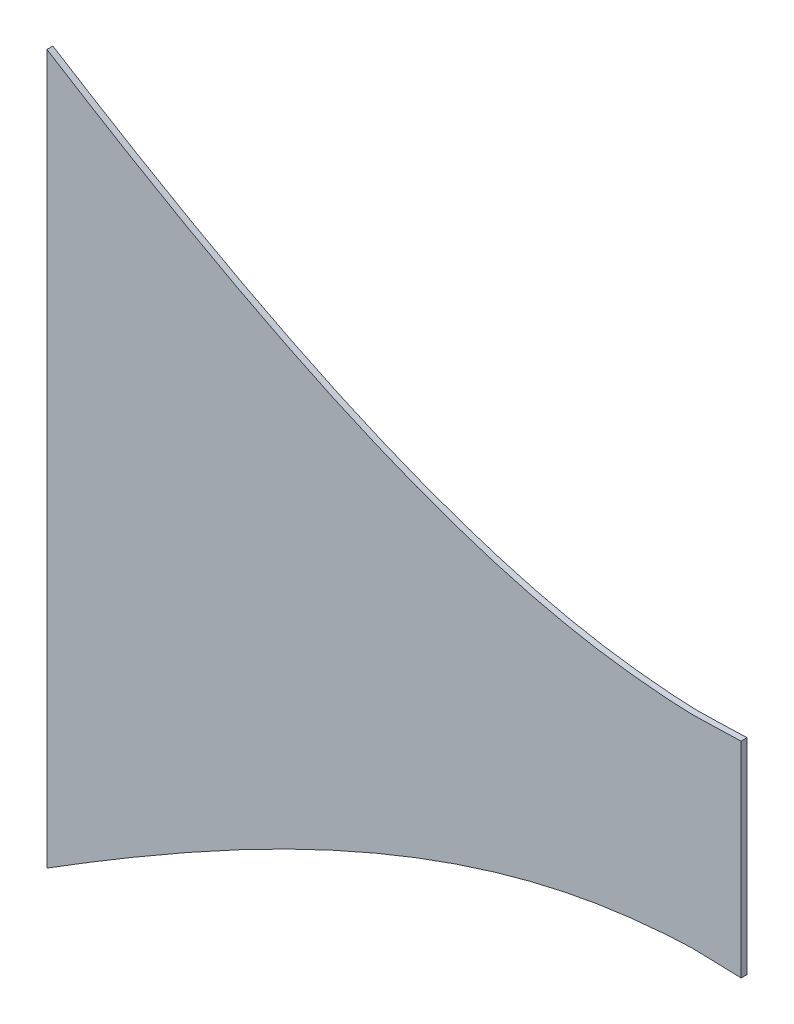
ISO-10303-21;
HEADER;
FILE_DESCRIPTION(('STEP AP214'),'2;1');
FILE_NAME('part.step','',(''),(''),'','','');
FILE_SCHEMA(('AUTOMOTIVE_DESIGN { 1 0 10303 214 1 1 1 1 }'));
ENDSEC;
DATA;
#1=APPLICATION_CONTEXT('core data for automotive mechanical design processes');
#2=APPLICATION_PROTOCOL_DEFINITION('international standard','automotive_design',2000,#1);
#3=PRODUCT_CONTEXT('',#1,'mechanical');
#4=PRODUCT('Part','Part','',(#3));
#5=PRODUCT_RELATED_PRODUCT_CATEGORY('part','',(#4));
#6=PRODUCT_DEFINITION_FORMATION('','',#4);
#7=PRODUCT_DEFINITION_CONTEXT('part definition',#1,'design');
#8=PRODUCT_DEFINITION('design','',#6,#7);
#9=PRODUCT_DEFINITION_SHAPE('','',#8);
#10=(LENGTH_UNIT() NAMED_UNIT(*) SI_UNIT(.MILLI.,.METRE.));
#11=(NAMED_UNIT(*) PLANE_ANGLE_UNIT() SI_UNIT($,.RADIAN.));
#12=(NAMED_UNIT(*) SI_UNIT($,.STERADIAN.) SOLID_ANGLE_UNIT());
#13=UNCERTAINTY_MEASURE_WITH_UNIT(LENGTH_MEASURE(1.E-05),#10,'distance_accuracy_value','');
#14=(GEOMETRIC_REPRESENTATION_CONTEXT(3) GLOBAL_UNCERTAINTY_ASSIGNED_CONTEXT((#13)) GLOBAL_UNIT_ASSIGNED_CONTEXT((#10,
#11,#12)) REPRESENTATION_CONTEXT('',''));
#15=CARTESIAN_POINT('',(0.,0.,0.));
#16=DIRECTION('',(0.,0.,1.));
#17=DIRECTION('',(1.,0.,0.));
#18=AXIS2_PLACEMENT_3D('',#15,#16,#17);
#19=CARTESIAN_POINT('',(630.060155948163,17.230821144255,0.5));
#20=CARTESIAN_POINT('',(630.060155948163,17.230821144255,-0.5));
#21=CARTESIAN_POINT('',(624.290147678381,17.1434943990268,0.5));
#22=CARTESIAN_POINT('',(624.290147678381,17.1434943990268,-0.5));
#23=CARTESIAN_POINT('',(623.249163071546,16.6434483722831,0.5));
#24=CARTESIAN_POINT('',(623.249163071546,16.6434483722831,-0.5));
#25=CARTESIAN_POINT('',(580.468042757777,20.422908744546,0.5));
#26=CARTESIAN_POINT('',(580.468042757777,20.422908744546,-0.5));
#27=CARTESIAN_POINT('',(542.806075293805,41.2067284704848,0.5));
#28=CARTESIAN_POINT('',(542.806075293805,41.2067284704848,-0.5));
#29=CARTESIAN_POINT('',(513.444999676251,59.5485061348377,0.5));
#30=CARTESIAN_POINT('',(513.444999676251,59.5485061348377,-0.5));
#31=(BOUNDED_SURFACE() B_SPLINE_SURFACE(3,1,((#19,#20),(#21,#22),(#23,#24),(#25,#26),(#27,#28),
(#29,#30)),.UNSPECIFIED.,.F.,.F.,.F.) B_SPLINE_SURFACE_WITH_KNOTS((4,1,1,4),(2,2),(0.,
0.149292969433812,0.239589353801839,0.902963843680264),(0.,1.),
.UNSPECIFIED.) GEOMETRIC_REPRESENTATION_ITEM() RATIONAL_B_SPLINE_SURFACE(((1.,1.),(1.,1.),(1.,
1.),(1.,1.),(1.,1.),(1.,1.))) REPRESENTATION_ITEM('') SURFACE());
#32=CARTESIAN_POINT('',(630.060155948163,17.230821144255,-0.5));
#33=CARTESIAN_POINT('',(624.290147678381,17.1434943990268,-0.5));
#34=CARTESIAN_POINT('',(623.249163071546,16.6434483722831,-0.5));
#35=CARTESIAN_POINT('',(580.468042757777,20.422908744546,-0.5));
#36=CARTESIAN_POINT('',(542.806075293805,41.2067284704848,-0.5));
#37=CARTESIAN_POINT('',(513.444999676251,59.5485061348377,-0.5));
#38=(BOUNDED_CURVE() B_SPLINE_CURVE(3,(#32,#33,#34,#35,#36,#37),.UNSPECIFIED.,.F.,
.F.) B_SPLINE_CURVE_WITH_KNOTS((4,1,1,4),(0.,0.149292969433812,0.239589353801839,
0.902963843680264),
.UNSPECIFIED.) CURVE() GEOMETRIC_REPRESENTATION_ITEM() RATIONAL_B_SPLINE_CURVE((1.,1.,1.,1.,1.,1.)) REPRESENTATION_ITEM(''));
#39=CARTESIAN_POINT('',(630.060155948163,17.230821144255,-0.5));
#40=VERTEX_POINT('',#39);
#41=CARTESIAN_POINT('',(513.444999676251,59.5485061348377,-0.5));
#42=VERTEX_POINT('',#41);
#43=EDGE_CURVE('E110',#40,#42,#38,.T.);
#44=DIRECTION('',(0.,0.,-1.));
#45=VECTOR('',#44,1.);
#46=CARTESIAN_POINT('',(513.444999676251,59.5485061348377,0.5));
#47=LINE('',#46,#45);
#48=CARTESIAN_POINT('',(513.444999676251,59.5485061348377,0.5));
#49=VERTEX_POINT('',#48);
#50=EDGE_CURVE('E149',#49,#42,#47,.T.);
#51=CARTESIAN_POINT('',(630.060155948163,17.230821144255,0.5));
#52=CARTESIAN_POINT('',(624.290147678381,17.1434943990268,0.5));
#53=CARTESIAN_POINT('',(623.249163071546,16.6434483722831,0.5));
#54=CARTESIAN_POINT('',(580.468042757777,20.422908744546,0.5));
#55=CARTESIAN_POINT('',(542.806075293805,41.2067284704848,0.5));
#56=CARTESIAN_POINT('',(513.444999676251,59.5485061348377,0.5));
#57=(BOUNDED_CURVE() B_SPLINE_CURVE(3,(#51,#52,#53,#54,#55,#56),.UNSPECIFIED.,.F.,
.F.) B_SPLINE_CURVE_WITH_KNOTS((4,1,1,4),(0.,0.149292969433812,0.239589353801839,
0.902963843680264),
.UNSPECIFIED.) CURVE() GEOMETRIC_REPRESENTATION_ITEM() RATIONAL_B_SPLINE_CURVE((1.,1.,1.,1.,1.,1.)) REPRESENTATION_ITEM(''));
#58=CARTESIAN_POINT('',(630.060155948163,17.230821144255,0.5));
#59=VERTEX_POINT('',#58);
#60=EDGE_CURVE('E155',#59,#49,#57,.T.);
#61=DIRECTION('',(0.,0.,-1.));
#62=VECTOR('',#61,1.);
#63=CARTESIAN_POINT('',(630.060155948163,17.230821144255,0.5));
#64=LINE('',#63,#62);
#65=EDGE_CURVE('E162',#59,#40,#64,.T.);
#66=ORIENTED_EDGE('',*,*,#43,.T.);
#67=ORIENTED_EDGE('',*,*,#50,.F.);
#68=ORIENTED_EDGE('',*,*,#60,.F.);
#69=ORIENTED_EDGE('',*,*,#65,.T.);
#70=EDGE_LOOP('',(#66,#67,#68,#69));
#71=FACE_BOUND('',#70,.T.);
#72=ADVANCED_FACE('F50',(#71),#31,.F.);
#73=CARTESIAN_POINT('',(576.986065958673,26.4563585070162,0.5));
#74=DIRECTION('',(0.,0.,-1.));
#75=DIRECTION('',(0.,-1.,0.));
#76=AXIS2_PLACEMENT_3D('',#73,#74,#75);
#77=PLANE('',#76);
#78=DIRECTION('',(0.,-1.,0.));
#79=VECTOR('',#78,1.);
#80=CARTESIAN_POINT('',(513.444999676251,59.5485061348377,0.5));
#81=LINE('',#80,#79);
#82=CARTESIAN_POINT('',(513.444999676251,-59.5485061348377,0.5));
#83=VERTEX_POINT('',#82);
#84=EDGE_CURVE('E80',#49,#83,#81,.T.);
#85=ORIENTED_EDGE('',*,*,#84,.T.);
#86=CARTESIAN_POINT('',(630.060155948163,-17.230821144255,0.5));
#87=CARTESIAN_POINT('',(624.290147678381,-17.1434943990268,0.5));
#88=CARTESIAN_POINT('',(623.249163071546,-16.6434483722831,0.5));
#89=CARTESIAN_POINT('',(580.468042757777,-20.422908744546,0.5));
#90=CARTESIAN_POINT('',(542.806075293805,-41.2067284704848,0.5));
#91=CARTESIAN_POINT('',(513.444999676251,-59.5485061348377,0.5));
#92=(BOUNDED_CURVE() B_SPLINE_CURVE(3,(#86,#87,#88,#89,#90,#91),.UNSPECIFIED.,.F.,
.F.) B_SPLINE_CURVE_WITH_KNOTS((4,1,1,4),(0.,0.149292969433812,0.239589353801839,
0.902963843680264),
.UNSPECIFIED.) CURVE() GEOMETRIC_REPRESENTATION_ITEM() RATIONAL_B_SPLINE_CURVE((1.,1.,1.,1.,1.,1.)) REPRESENTATION_ITEM(''));
#93=CARTESIAN_POINT('',(630.060155948163,-17.230821144255,0.5));
#94=VERTEX_POINT('',#93);
#95=EDGE_CURVE('E121',#94,#83,#92,.T.);
#96=ORIENTED_EDGE('',*,*,#95,.F.);
#97=DIRECTION('',(0.,1.,0.));
#98=VECTOR('',#97,1.);
#99=CARTESIAN_POINT('',(630.060155948163,17.230821144255,0.5));
#100=LINE('',#99,#98);
#101=EDGE_CURVE('E11',#94,#59,#100,.T.);
#102=ORIENTED_EDGE('',*,*,#101,.T.);
#103=ORIENTED_EDGE('',*,*,#60,.T.);
#104=EDGE_LOOP('',(#85,#96,#102,#103));
#105=FACE_BOUND('',#104,.T.);
#106=ADVANCED_FACE('F175',(#105),#77,.F.);
#107=CARTESIAN_POINT('',(576.986065958673,26.4563585070162,-0.5));
#108=DIRECTION('',(0.,0.,-1.));
#109=DIRECTION('',(0.,-1.,0.));
#110=AXIS2_PLACEMENT_3D('',#107,#108,#109);
#111=PLANE('',#110);
#112=DIRECTION('',(0.,1.,0.));
#113=VECTOR('',#112,1.);
#114=CARTESIAN_POINT('',(630.060155948163,17.230821144255,-0.5));
#115=LINE('',#114,#113);
#116=CARTESIAN_POINT('',(630.060155948163,-17.230821144255,-0.5));
#117=VERTEX_POINT('',#116);
#118=EDGE_CURVE('E59',#117,#40,#115,.T.);
#119=ORIENTED_EDGE('',*,*,#118,.F.);
#120=CARTESIAN_POINT('',(630.060155948163,-17.230821144255,-0.5));
#121=CARTESIAN_POINT('',(624.290147678381,-17.1434943990268,-0.5));
#122=CARTESIAN_POINT('',(623.249163071546,-16.6434483722831,-0.5));
#123=CARTESIAN_POINT('',(580.468042757777,-20.422908744546,-0.5));
#124=CARTESIAN_POINT('',(542.806075293805,-41.2067284704848,-0.5));
#125=CARTESIAN_POINT('',(513.444999676251,-59.5485061348377,-0.5));
#126=(BOUNDED_CURVE() B_SPLINE_CURVE(3,(#120,#121,#122,#123,#124,#125),.UNSPECIFIED.,.F.,
.F.) B_SPLINE_CURVE_WITH_KNOTS((4,1,1,4),(0.,0.149292969433812,0.239589353801839,
0.902963843680264),
.UNSPECIFIED.) CURVE() GEOMETRIC_REPRESENTATION_ITEM() RATIONAL_B_SPLINE_CURVE((1.,1.,1.,1.,1.,1.)) REPRESENTATION_ITEM(''));
#127=CARTESIAN_POINT('',(513.444999676251,-59.5485061348377,-0.5));
#128=VERTEX_POINT('',#127);
#129=EDGE_CURVE('E108',#117,#128,#126,.T.);
#130=ORIENTED_EDGE('',*,*,#129,.T.);
#131=DIRECTION('',(0.,-1.,0.));
#132=VECTOR('',#131,1.);
#133=CARTESIAN_POINT('',(513.444999676251,59.5485061348377,-0.5));
#134=LINE('',#133,#132);
#135=EDGE_CURVE('E158',#42,#128,#134,.T.);
#136=ORIENTED_EDGE('',*,*,#135,.F.);
#137=ORIENTED_EDGE('',*,*,#43,.F.);
#138=EDGE_LOOP('',(#119,#130,#136,#137));
#139=FACE_BOUND('',#138,.T.);
#140=ADVANCED_FACE('F52',(#139),#111,.T.);
#141=CARTESIAN_POINT('',(513.444999676251,59.5485061348377,0.5));
#142=DIRECTION('',(1.,0.,0.));
#143=DIRECTION('',(0.,1.,0.));
#144=AXIS2_PLACEMENT_3D('',#141,#142,#143);
#145=PLANE('',#144);
#146=ORIENTED_EDGE('',*,*,#135,.T.);
#147=DIRECTION('',(0.,0.,-1.));
#148=VECTOR('',#147,1.);
#149=CARTESIAN_POINT('',(513.444999676251,-59.5485061348377,0.5));
#150=LINE('',#149,#148);
#151=EDGE_CURVE('E125',#83,#128,#150,.T.);
#152=ORIENTED_EDGE('',*,*,#151,.F.);
#153=ORIENTED_EDGE('',*,*,#84,.F.);
#154=ORIENTED_EDGE('',*,*,#50,.T.);
#155=EDGE_LOOP('',(#146,#152,#153,#154));
#156=FACE_BOUND('',#155,.T.);
#157=ADVANCED_FACE('F171',(#156),#145,.F.);
#158=CARTESIAN_POINT('',(630.060155948163,17.230821144255,0.5));
#159=DIRECTION('',(-1.,0.,0.));
#160=DIRECTION('',(0.,1.,0.));
#161=AXIS2_PLACEMENT_3D('',#158,#159,#160);
#162=PLANE('',#161);
#163=ORIENTED_EDGE('',*,*,#101,.F.);
#164=DIRECTION('',(0.,0.,-1.));
#165=VECTOR('',#164,1.);
#166=CARTESIAN_POINT('',(630.060155948163,-17.230821144255,0.5));
#167=LINE('',#166,#165);
#168=EDGE_CURVE('E116',#94,#117,#167,.T.);
#169=ORIENTED_EDGE('',*,*,#168,.T.);
#170=ORIENTED_EDGE('',*,*,#118,.T.);
#171=ORIENTED_EDGE('',*,*,#65,.F.);
#172=EDGE_LOOP('',(#163,#169,#170,#171));
#173=FACE_BOUND('',#172,.T.);
#174=ADVANCED_FACE('F117',(#173),#162,.F.);
#175=CARTESIAN_POINT('',(630.060155948163,-17.230821144255,0.5));
#176=CARTESIAN_POINT('',(630.060155948163,-17.230821144255,-0.5));
#177=CARTESIAN_POINT('',(624.290147678381,-17.1434943990268,0.5));
#178=CARTESIAN_POINT('',(624.290147678381,-17.1434943990268,-0.5));
#179=CARTESIAN_POINT('',(623.249163071546,-16.6434483722831,0.5));
#180=CARTESIAN_POINT('',(623.249163071546,-16.6434483722831,-0.5));
#181=CARTESIAN_POINT('',(580.468042757777,-20.422908744546,0.5));
#182=CARTESIAN_POINT('',(580.468042757777,-20.422908744546,-0.5));
#183=CARTESIAN_POINT('',(542.806075293805,-41.2067284704848,0.5));
#184=CARTESIAN_POINT('',(542.806075293805,-41.2067284704848,-0.5));
#185=CARTESIAN_POINT('',(513.444999676251,-59.5485061348377,0.5));
#186=CARTESIAN_POINT('',(513.444999676251,-59.5485061348377,-0.5));
#187=(BOUNDED_SURFACE() B_SPLINE_SURFACE(3,1,((#175,#176),(#177,#178),(#179,#180),(#181,#182),
(#183,#184),(#185,#186)),.UNSPECIFIED.,.F.,.F.,.F.) B_SPLINE_SURFACE_WITH_KNOTS((4,1,1,4),(2,2),
(0.,0.149292969433812,0.239589353801839,0.902963843680264),(0.,1.),
.UNSPECIFIED.) GEOMETRIC_REPRESENTATION_ITEM() RATIONAL_B_SPLINE_SURFACE(((1.,1.),(1.,1.),(1.,
1.),(1.,1.),(1.,1.),(1.,1.))) REPRESENTATION_ITEM('') SURFACE());
#188=ORIENTED_EDGE('',*,*,#129,.F.);
#189=ORIENTED_EDGE('',*,*,#168,.F.);
#190=ORIENTED_EDGE('',*,*,#95,.T.);
#191=ORIENTED_EDGE('',*,*,#151,.T.);
#192=EDGE_LOOP('',(#188,#189,#190,#191));
#193=FACE_BOUND('',#192,.T.);
#194=ADVANCED_FACE('F124',(#193),#187,.T.);
#195=CLOSED_SHELL('',(#72,#106,#140,#157,#174,#194));
#196=MANIFOLD_SOLID_BREP('B2',#195);
#197=ADVANCED_BREP_SHAPE_REPRESENTATION('',(#18,#196),#14);
#198=SHAPE_DEFINITION_REPRESENTATION(#9,#197);
ENDSEC;
END-ISO-10303-21;
